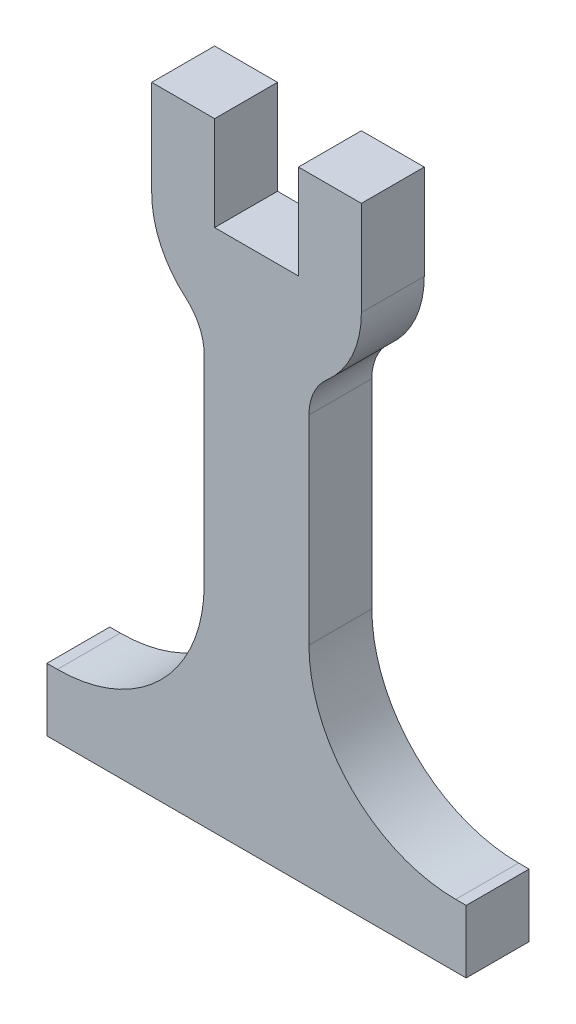
ISO-10303-21;
HEADER;
FILE_DESCRIPTION(('STEP AP214'),'2;1');
FILE_NAME('part.step','',(''),(''),'','','');
FILE_SCHEMA(('AUTOMOTIVE_DESIGN { 1 0 10303 214 1 1 1 1 }'));
ENDSEC;
DATA;
#1=APPLICATION_CONTEXT('core data for automotive mechanical design processes');
#2=APPLICATION_PROTOCOL_DEFINITION('international standard','automotive_design',2000,#1);
#3=PRODUCT_CONTEXT('',#1,'mechanical');
#4=PRODUCT('Part','Part','',(#3));
#5=PRODUCT_RELATED_PRODUCT_CATEGORY('part','',(#4));
#6=PRODUCT_DEFINITION_FORMATION('','',#4);
#7=PRODUCT_DEFINITION_CONTEXT('part definition',#1,'design');
#8=PRODUCT_DEFINITION('design','',#6,#7);
#9=PRODUCT_DEFINITION_SHAPE('','',#8);
#10=(LENGTH_UNIT() NAMED_UNIT(*) SI_UNIT(.MILLI.,.METRE.));
#11=(NAMED_UNIT(*) PLANE_ANGLE_UNIT() SI_UNIT($,.RADIAN.));
#12=(NAMED_UNIT(*) SI_UNIT($,.STERADIAN.) SOLID_ANGLE_UNIT());
#13=UNCERTAINTY_MEASURE_WITH_UNIT(LENGTH_MEASURE(1.E-05),#10,'distance_accuracy_value','');
#14=(GEOMETRIC_REPRESENTATION_CONTEXT(3) GLOBAL_UNCERTAINTY_ASSIGNED_CONTEXT((#13)) GLOBAL_UNIT_ASSIGNED_CONTEXT((#10,
#11,#12)) REPRESENTATION_CONTEXT('',''));
#15=CARTESIAN_POINT('',(0.,0.,0.));
#16=DIRECTION('',(0.,0.,1.));
#17=DIRECTION('',(1.,0.,0.));
#18=AXIS2_PLACEMENT_3D('',#15,#16,#17);
#19=CARTESIAN_POINT('',(3.,3.,3.));
#20=DIRECTION('',(-1.,0.,0.));
#21=DIRECTION('',(0.,0.,1.));
#22=AXIS2_PLACEMENT_3D('',#19,#20,#21);
#23=PLANE('',#22);
#24=DIRECTION('',(0.,1.,0.));
#25=VECTOR('',#24,1.);
#26=CARTESIAN_POINT('',(3.,3.,0.));
#27=LINE('',#26,#25);
#28=CARTESIAN_POINT('',(3.,0.,0.));
#29=VERTEX_POINT('',#28);
#30=CARTESIAN_POINT('',(3.,4.5,0.));
#31=VERTEX_POINT('',#30);
#32=EDGE_CURVE('E126',#29,#31,#27,.T.);
#33=ORIENTED_EDGE('',*,*,#32,.T.);
#34=DIRECTION('',(0.,0.,-1.));
#35=VECTOR('',#34,1.);
#36=CARTESIAN_POINT('',(3.,4.5,3.));
#37=LINE('',#36,#35);
#38=CARTESIAN_POINT('',(3.,4.5,3.));
#39=VERTEX_POINT('',#38);
#40=EDGE_CURVE('E11',#39,#31,#37,.T.);
#41=ORIENTED_EDGE('',*,*,#40,.F.);
#42=DIRECTION('',(0.,1.,0.));
#43=VECTOR('',#42,1.);
#44=CARTESIAN_POINT('',(3.,0.,3.));
#45=LINE('',#44,#43);
#46=CARTESIAN_POINT('',(3.,0.,3.));
#47=VERTEX_POINT('',#46);
#48=EDGE_CURVE('E133',#47,#39,#45,.T.);
#49=ORIENTED_EDGE('',*,*,#48,.F.);
#50=DIRECTION('',(0.,0.,-1.));
#51=VECTOR('',#50,1.);
#52=CARTESIAN_POINT('',(3.,0.,3.));
#53=LINE('',#52,#51);
#54=EDGE_CURVE('E56',#47,#29,#53,.T.);
#55=ORIENTED_EDGE('',*,*,#54,.T.);
#56=EDGE_LOOP('',(#33,#41,#49,#55));
#57=FACE_BOUND('',#56,.T.);
#58=ADVANCED_FACE('F39',(#57),#23,.F.);
#59=CARTESIAN_POINT('',(0.,4.5,3.));
#60=DIRECTION('',(0.,1.,0.));
#61=DIRECTION('',(0.,0.,1.));
#62=AXIS2_PLACEMENT_3D('',#59,#60,#61);
#63=PLANE('',#62);
#64=DIRECTION('',(1.,0.,0.));
#65=VECTOR('',#64,1.);
#66=CARTESIAN_POINT('',(0.,4.5,0.));
#67=LINE('',#66,#65);
#68=CARTESIAN_POINT('',(0.,4.5,0.));
#69=VERTEX_POINT('',#68);
#70=EDGE_CURVE('E215',#69,#31,#67,.T.);
#71=ORIENTED_EDGE('',*,*,#70,.F.);
#72=DIRECTION('',(0.,0.,-1.));
#73=VECTOR('',#72,1.);
#74=CARTESIAN_POINT('',(0.,4.5,3.));
#75=LINE('',#74,#73);
#76=CARTESIAN_POINT('',(0.,4.5,3.));
#77=VERTEX_POINT('',#76);
#78=EDGE_CURVE('E48',#77,#69,#75,.T.);
#79=ORIENTED_EDGE('',*,*,#78,.F.);
#80=DIRECTION('',(1.,0.,0.));
#81=VECTOR('',#80,1.);
#82=CARTESIAN_POINT('',(0.,4.5,3.));
#83=LINE('',#82,#81);
#84=EDGE_CURVE('E362',#77,#39,#83,.T.);
#85=ORIENTED_EDGE('',*,*,#84,.T.);
#86=ORIENTED_EDGE('',*,*,#40,.T.);
#87=EDGE_LOOP('',(#71,#79,#85,#86));
#88=FACE_BOUND('',#87,.T.);
#89=ADVANCED_FACE('F344',(#88),#63,.T.);
#90=CARTESIAN_POINT('',(0.,0.,3.));
#91=DIRECTION('',(1.,0.,0.));
#92=DIRECTION('',(0.,1.,0.));
#93=AXIS2_PLACEMENT_3D('',#90,#91,#92);
#94=PLANE('',#93);
#95=DIRECTION('',(0.,-1.,0.));
#96=VECTOR('',#95,1.);
#97=CARTESIAN_POINT('',(0.,0.,0.));
#98=LINE('',#97,#96);
#99=CARTESIAN_POINT('',(0.,-0.0758606394981101,0.));
#100=VERTEX_POINT('',#99);
#101=EDGE_CURVE('E218',#69,#100,#98,.T.);
#102=ORIENTED_EDGE('',*,*,#101,.T.);
#103=DIRECTION('',(0.,0.,-1.));
#104=VECTOR('',#103,1.);
#105=CARTESIAN_POINT('',(0.,-0.0758606394981101,3.));
#106=LINE('',#105,#104);
#107=CARTESIAN_POINT('',(0.,-0.0758606394981101,3.));
#108=VERTEX_POINT('',#107);
#109=EDGE_CURVE('E331',#108,#100,#106,.T.);
#110=ORIENTED_EDGE('',*,*,#109,.F.);
#111=DIRECTION('',(0.,1.,0.));
#112=VECTOR('',#111,1.);
#113=CARTESIAN_POINT('',(0.,3.,3.));
#114=LINE('',#113,#112);
#115=EDGE_CURVE('E341',#108,#77,#114,.T.);
#116=ORIENTED_EDGE('',*,*,#115,.T.);
#117=ORIENTED_EDGE('',*,*,#78,.T.);
#118=EDGE_LOOP('',(#102,#110,#116,#117));
#119=FACE_BOUND('',#118,.T.);
#120=ADVANCED_FACE('F339',(#119),#94,.F.);
#121=CARTESIAN_POINT('',(4.62293397851248,-0.0758606394981107,3.));
#122=DIRECTION('',(0.,0.,-1.));
#123=DIRECTION('',(-1.,0.,0.));
#124=AXIS2_PLACEMENT_3D('',#121,#122,#123);
#125=CYLINDRICAL_SURFACE('',#124,4.62293397851248);
#126=CARTESIAN_POINT('',(4.62293397851248,-0.0758606394981107,0.));
#127=DIRECTION('',(0.,0.,1.));
#128=DIRECTION('',(1.,0.,0.));
#129=AXIS2_PLACEMENT_3D('',#126,#127,#128);
#130=CIRCLE('',#129,4.62293397851248);
#131=CARTESIAN_POINT('',(1.62476454964812,-3.59473810901994,0.));
#132=VERTEX_POINT('',#131);
#133=EDGE_CURVE('E221',#100,#132,#130,.T.);
#134=ORIENTED_EDGE('',*,*,#133,.T.);
#135=DIRECTION('',(0.,0.,-1.));
#136=VECTOR('',#135,1.);
#137=CARTESIAN_POINT('',(1.62476454964812,-3.59473810901994,3.));
#138=LINE('',#137,#136);
#139=CARTESIAN_POINT('',(1.62476454964812,-3.59473810901994,3.));
#140=VERTEX_POINT('',#139);
#141=EDGE_CURVE('E328',#140,#132,#138,.T.);
#142=ORIENTED_EDGE('',*,*,#141,.F.);
#143=CARTESIAN_POINT('',(4.62293397851248,-0.0758606394981107,3.));
#144=DIRECTION('',(0.,0.,1.));
#145=DIRECTION('',(1.,0.,0.));
#146=AXIS2_PLACEMENT_3D('',#143,#144,#145);
#147=CIRCLE('',#146,4.62293397851248);
#148=EDGE_CURVE('E353',#108,#140,#147,.T.);
#149=ORIENTED_EDGE('',*,*,#148,.F.);
#150=ORIENTED_EDGE('',*,*,#109,.T.);
#151=EDGE_LOOP('',(#134,#142,#149,#150));
#152=FACE_BOUND('',#151,.T.);
#153=ADVANCED_FACE('F350',(#152),#125,.T.);
#154=CARTESIAN_POINT('',(0.00969720289214311,-5.49030279710786,3.));
#155=DIRECTION('',(0.,0.,-1.));
#156=DIRECTION('',(-1.,0.,0.));
#157=AXIS2_PLACEMENT_3D('',#154,#155,#156);
#158=CYLINDRICAL_SURFACE('',#157,2.49030279710786);
#159=CARTESIAN_POINT('',(0.00969720289214311,-5.49030279710786,0.));
#160=DIRECTION('',(0.,0.,1.));
#161=DIRECTION('',(1.,0.,0.));
#162=AXIS2_PLACEMENT_3D('',#159,#160,#161);
#163=CIRCLE('',#162,2.49030279710786);
#164=CARTESIAN_POINT('',(2.5,-5.49030279710788,0.));
#165=VERTEX_POINT('',#164);
#166=EDGE_CURVE('E225',#165,#132,#163,.T.);
#167=ORIENTED_EDGE('',*,*,#166,.F.);
#168=DIRECTION('',(0.,0.,-1.));
#169=VECTOR('',#168,1.);
#170=CARTESIAN_POINT('',(2.5,-5.49030279710788,3.));
#171=LINE('',#170,#169);
#172=CARTESIAN_POINT('',(2.5,-5.49030279710788,3.));
#173=VERTEX_POINT('',#172);
#174=EDGE_CURVE('E324',#173,#165,#171,.T.);
#175=ORIENTED_EDGE('',*,*,#174,.F.);
#176=CARTESIAN_POINT('',(0.00969720289214311,-5.49030279710786,3.));
#177=DIRECTION('',(0.,0.,1.));
#178=DIRECTION('',(1.,0.,0.));
#179=AXIS2_PLACEMENT_3D('',#176,#177,#178);
#180=CIRCLE('',#179,2.49030279710786);
#181=EDGE_CURVE('E356',#173,#140,#180,.T.);
#182=ORIENTED_EDGE('',*,*,#181,.T.);
#183=ORIENTED_EDGE('',*,*,#141,.T.);
#184=EDGE_LOOP('',(#167,#175,#182,#183));
#185=FACE_BOUND('',#184,.T.);
#186=ADVANCED_FACE('F433',(#185),#158,.F.);
#187=CARTESIAN_POINT('',(2.5,-12.5,3.));
#188=DIRECTION('',(1.,0.,0.));
#189=DIRECTION('',(0.,0.,-1.));
#190=AXIS2_PLACEMENT_3D('',#187,#188,#189);
#191=PLANE('',#190);
#192=DIRECTION('',(0.,-1.,0.));
#193=VECTOR('',#192,1.);
#194=CARTESIAN_POINT('',(2.5,-12.5,0.));
#195=LINE('',#194,#193);
#196=CARTESIAN_POINT('',(2.5,-15.,0.));
#197=VERTEX_POINT('',#196);
#198=EDGE_CURVE('E229',#165,#197,#195,.T.);
#199=ORIENTED_EDGE('',*,*,#198,.T.);
#200=DIRECTION('',(0.,0.,-1.));
#201=VECTOR('',#200,1.);
#202=CARTESIAN_POINT('',(2.5,-15.,3.));
#203=LINE('',#202,#201);
#204=CARTESIAN_POINT('',(2.5,-15.,3.));
#205=VERTEX_POINT('',#204);
#206=EDGE_CURVE('E321',#205,#197,#203,.T.);
#207=ORIENTED_EDGE('',*,*,#206,.F.);
#208=DIRECTION('',(0.,1.,0.));
#209=VECTOR('',#208,1.);
#210=CARTESIAN_POINT('',(2.5,-6.25,3.));
#211=LINE('',#210,#209);
#212=EDGE_CURVE('E360',#205,#173,#211,.T.);
#213=ORIENTED_EDGE('',*,*,#212,.T.);
#214=ORIENTED_EDGE('',*,*,#174,.T.);
#215=EDGE_LOOP('',(#199,#207,#213,#214));
#216=FACE_BOUND('',#215,.T.);
#217=ADVANCED_FACE('F436',(#216),#191,.F.);
#218=CARTESIAN_POINT('',(-4.5,-15.,3.));
#219=DIRECTION('',(0.,0.,-1.));
#220=DIRECTION('',(-1.,0.,0.));
#221=AXIS2_PLACEMENT_3D('',#218,#219,#220);
#222=CYLINDRICAL_SURFACE('',#221,7.);
#223=CARTESIAN_POINT('',(-4.5,-15.,0.));
#224=DIRECTION('',(0.,0.,1.));
#225=DIRECTION('',(1.,0.,0.));
#226=AXIS2_PLACEMENT_3D('',#223,#224,#225);
#227=CIRCLE('',#226,7.);
#228=CARTESIAN_POINT('',(-4.50000000000005,-22.,0.));
#229=VERTEX_POINT('',#228);
#230=EDGE_CURVE('E233',#229,#197,#227,.T.);
#231=ORIENTED_EDGE('',*,*,#230,.F.);
#232=DIRECTION('',(0.,0.,-1.));
#233=VECTOR('',#232,1.);
#234=CARTESIAN_POINT('',(-4.50000000000005,-22.,3.));
#235=LINE('',#234,#233);
#236=CARTESIAN_POINT('',(-4.50000000000005,-22.,3.));
#237=VERTEX_POINT('',#236);
#238=EDGE_CURVE('E318',#237,#229,#235,.T.);
#239=ORIENTED_EDGE('',*,*,#238,.F.);
#240=CARTESIAN_POINT('',(-4.5,-15.,3.));
#241=DIRECTION('',(0.,0.,1.));
#242=DIRECTION('',(1.,0.,0.));
#243=AXIS2_PLACEMENT_3D('',#240,#241,#242);
#244=CIRCLE('',#243,7.);
#245=EDGE_CURVE('E369',#237,#205,#244,.T.);
#246=ORIENTED_EDGE('',*,*,#245,.T.);
#247=ORIENTED_EDGE('',*,*,#206,.T.);
#248=EDGE_LOOP('',(#231,#239,#246,#247));
#249=FACE_BOUND('',#248,.T.);
#250=ADVANCED_FACE('F440',(#249),#222,.F.);
#251=CARTESIAN_POINT('',(-5.,-22.,3.));
#252=DIRECTION('',(0.,1.,0.));
#253=DIRECTION('',(0.,0.,1.));
#254=AXIS2_PLACEMENT_3D('',#251,#252,#253);
#255=PLANE('',#254);
#256=DIRECTION('',(1.,0.,0.));
#257=VECTOR('',#256,1.);
#258=CARTESIAN_POINT('',(-5.,-22.,0.));
#259=LINE('',#258,#257);
#260=CARTESIAN_POINT('',(-5.,-22.,0.));
#261=VERTEX_POINT('',#260);
#262=EDGE_CURVE('E237',#261,#229,#259,.T.);
#263=ORIENTED_EDGE('',*,*,#262,.F.);
#264=DIRECTION('',(0.,0.,-1.));
#265=VECTOR('',#264,1.);
#266=CARTESIAN_POINT('',(-5.,-22.,3.));
#267=LINE('',#266,#265);
#268=CARTESIAN_POINT('',(-5.,-22.,3.));
#269=VERTEX_POINT('',#268);
#270=EDGE_CURVE('E315',#269,#261,#267,.T.);
#271=ORIENTED_EDGE('',*,*,#270,.F.);
#272=DIRECTION('',(1.,0.,0.));
#273=VECTOR('',#272,1.);
#274=CARTESIAN_POINT('',(-5.,-22.,3.));
#275=LINE('',#274,#273);
#276=EDGE_CURVE('E373',#269,#237,#275,.T.);
#277=ORIENTED_EDGE('',*,*,#276,.T.);
#278=ORIENTED_EDGE('',*,*,#238,.T.);
#279=EDGE_LOOP('',(#263,#271,#277,#278));
#280=FACE_BOUND('',#279,.T.);
#281=ADVANCED_FACE('F444',(#280),#255,.T.);
#282=CARTESIAN_POINT('',(-5.,-25.,3.));
#283=DIRECTION('',(-1.,0.,0.));
#284=DIRECTION('',(0.,0.,1.));
#285=AXIS2_PLACEMENT_3D('',#282,#283,#284);
#286=PLANE('',#285);
#287=DIRECTION('',(0.,1.,0.));
#288=VECTOR('',#287,1.);
#289=CARTESIAN_POINT('',(-5.,-25.,0.));
#290=LINE('',#289,#288);
#291=CARTESIAN_POINT('',(-5.,-25.,0.));
#292=VERTEX_POINT('',#291);
#293=EDGE_CURVE('E241',#292,#261,#290,.T.);
#294=ORIENTED_EDGE('',*,*,#293,.F.);
#295=DIRECTION('',(0.,0.,-1.));
#296=VECTOR('',#295,1.);
#297=CARTESIAN_POINT('',(-5.,-25.,3.));
#298=LINE('',#297,#296);
#299=CARTESIAN_POINT('',(-5.,-25.,3.));
#300=VERTEX_POINT('',#299);
#301=EDGE_CURVE('E312',#300,#292,#298,.T.);
#302=ORIENTED_EDGE('',*,*,#301,.F.);
#303=DIRECTION('',(0.,1.,0.));
#304=VECTOR('',#303,1.);
#305=CARTESIAN_POINT('',(-5.,-25.,3.));
#306=LINE('',#305,#304);
#307=EDGE_CURVE('E377',#300,#269,#306,.T.);
#308=ORIENTED_EDGE('',*,*,#307,.T.);
#309=ORIENTED_EDGE('',*,*,#270,.T.);
#310=EDGE_LOOP('',(#294,#302,#308,#309));
#311=FACE_BOUND('',#310,.T.);
#312=ADVANCED_FACE('F448',(#311),#286,.T.);
#313=CARTESIAN_POINT('',(-5.,-25.,3.));
#314=DIRECTION('',(0.,1.,0.));
#315=DIRECTION('',(0.,0.,1.));
#316=AXIS2_PLACEMENT_3D('',#313,#314,#315);
#317=PLANE('',#316);
#318=DIRECTION('',(1.,0.,0.));
#319=VECTOR('',#318,1.);
#320=CARTESIAN_POINT('',(-5.,-25.,0.));
#321=LINE('',#320,#319);
#322=CARTESIAN_POINT('',(15.,-25.,0.));
#323=VERTEX_POINT('',#322);
#324=EDGE_CURVE('E245',#292,#323,#321,.T.);
#325=ORIENTED_EDGE('',*,*,#324,.T.);
#326=DIRECTION('',(0.,0.,-1.));
#327=VECTOR('',#326,1.);
#328=CARTESIAN_POINT('',(15.,-25.,3.));
#329=LINE('',#328,#327);
#330=CARTESIAN_POINT('',(15.,-25.,3.));
#331=VERTEX_POINT('',#330);
#332=EDGE_CURVE('E308',#331,#323,#329,.T.);
#333=ORIENTED_EDGE('',*,*,#332,.F.);
#334=DIRECTION('',(1.,0.,0.));
#335=VECTOR('',#334,1.);
#336=CARTESIAN_POINT('',(-5.,-25.,3.));
#337=LINE('',#336,#335);
#338=EDGE_CURVE('E381',#300,#331,#337,.T.);
#339=ORIENTED_EDGE('',*,*,#338,.F.);
#340=ORIENTED_EDGE('',*,*,#301,.T.);
#341=EDGE_LOOP('',(#325,#333,#339,#340));
#342=FACE_BOUND('',#341,.T.);
#343=ADVANCED_FACE('F452',(#342),#317,.F.);
#344=CARTESIAN_POINT('',(15.,-25.,3.));
#345=DIRECTION('',(-1.,0.,0.));
#346=DIRECTION('',(0.,0.,1.));
#347=AXIS2_PLACEMENT_3D('',#344,#345,#346);
#348=PLANE('',#347);
#349=DIRECTION('',(0.,1.,0.));
#350=VECTOR('',#349,1.);
#351=CARTESIAN_POINT('',(15.,-25.,0.));
#352=LINE('',#351,#350);
#353=CARTESIAN_POINT('',(15.,-22.,0.));
#354=VERTEX_POINT('',#353);
#355=EDGE_CURVE('E248',#323,#354,#352,.T.);
#356=ORIENTED_EDGE('',*,*,#355,.T.);
#357=DIRECTION('',(0.,0.,-1.));
#358=VECTOR('',#357,1.);
#359=CARTESIAN_POINT('',(15.,-22.,3.));
#360=LINE('',#359,#358);
#361=CARTESIAN_POINT('',(15.,-22.,3.));
#362=VERTEX_POINT('',#361);
#363=EDGE_CURVE('E305',#362,#354,#360,.T.);
#364=ORIENTED_EDGE('',*,*,#363,.F.);
#365=DIRECTION('',(0.,1.,0.));
#366=VECTOR('',#365,1.);
#367=CARTESIAN_POINT('',(15.,-25.,3.));
#368=LINE('',#367,#366);
#369=EDGE_CURVE('E384',#331,#362,#368,.T.);
#370=ORIENTED_EDGE('',*,*,#369,.F.);
#371=ORIENTED_EDGE('',*,*,#332,.T.);
#372=EDGE_LOOP('',(#356,#364,#370,#371));
#373=FACE_BOUND('',#372,.T.);
#374=ADVANCED_FACE('F456',(#373),#348,.F.);
#375=CARTESIAN_POINT('',(14.5000000000001,-22.,3.));
#376=DIRECTION('',(0.,1.,0.));
#377=DIRECTION('',(0.,0.,1.));
#378=AXIS2_PLACEMENT_3D('',#375,#376,#377);
#379=PLANE('',#378);
#380=DIRECTION('',(1.,0.,0.));
#381=VECTOR('',#380,1.);
#382=CARTESIAN_POINT('',(14.5000000000001,-22.,0.));
#383=LINE('',#382,#381);
#384=CARTESIAN_POINT('',(14.5000000000001,-22.,0.));
#385=VERTEX_POINT('',#384);
#386=EDGE_CURVE('E252',#385,#354,#383,.T.);
#387=ORIENTED_EDGE('',*,*,#386,.F.);
#388=DIRECTION('',(0.,0.,-1.));
#389=VECTOR('',#388,1.);
#390=CARTESIAN_POINT('',(14.5000000000001,-22.,3.));
#391=LINE('',#390,#389);
#392=CARTESIAN_POINT('',(14.5000000000001,-22.,3.));
#393=VERTEX_POINT('',#392);
#394=EDGE_CURVE('E302',#393,#385,#391,.T.);
#395=ORIENTED_EDGE('',*,*,#394,.F.);
#396=DIRECTION('',(1.,0.,0.));
#397=VECTOR('',#396,1.);
#398=CARTESIAN_POINT('',(14.5000000000001,-22.,3.));
#399=LINE('',#398,#397);
#400=EDGE_CURVE('E387',#393,#362,#399,.T.);
#401=ORIENTED_EDGE('',*,*,#400,.T.);
#402=ORIENTED_EDGE('',*,*,#363,.T.);
#403=EDGE_LOOP('',(#387,#395,#401,#402));
#404=FACE_BOUND('',#403,.T.);
#405=ADVANCED_FACE('F460',(#404),#379,.T.);
#406=CARTESIAN_POINT('',(14.5,-15.,3.));
#407=DIRECTION('',(0.,0.,-1.));
#408=DIRECTION('',(-1.,0.,0.));
#409=AXIS2_PLACEMENT_3D('',#406,#407,#408);
#410=CYLINDRICAL_SURFACE('',#409,7.);
#411=CARTESIAN_POINT('',(14.5,-15.,0.));
#412=DIRECTION('',(0.,0.,-1.));
#413=DIRECTION('',(-1.,0.,0.));
#414=AXIS2_PLACEMENT_3D('',#411,#412,#413);
#415=CIRCLE('',#414,7.);
#416=CARTESIAN_POINT('',(7.5,-15.,0.));
#417=VERTEX_POINT('',#416);
#418=EDGE_CURVE('E256',#385,#417,#415,.T.);
#419=ORIENTED_EDGE('',*,*,#418,.T.);
#420=DIRECTION('',(0.,0.,-1.));
#421=VECTOR('',#420,1.);
#422=CARTESIAN_POINT('',(7.5,-15.,3.));
#423=LINE('',#422,#421);
#424=CARTESIAN_POINT('',(7.5,-15.,3.));
#425=VERTEX_POINT('',#424);
#426=EDGE_CURVE('E298',#425,#417,#423,.T.);
#427=ORIENTED_EDGE('',*,*,#426,.F.);
#428=CARTESIAN_POINT('',(14.5,-15.,3.));
#429=DIRECTION('',(0.,0.,-1.));
#430=DIRECTION('',(-1.,0.,0.));
#431=AXIS2_PLACEMENT_3D('',#428,#429,#430);
#432=CIRCLE('',#431,7.);
#433=EDGE_CURVE('E391',#393,#425,#432,.T.);
#434=ORIENTED_EDGE('',*,*,#433,.F.);
#435=ORIENTED_EDGE('',*,*,#394,.T.);
#436=EDGE_LOOP('',(#419,#427,#434,#435));
#437=FACE_BOUND('',#436,.T.);
#438=ADVANCED_FACE('F464',(#437),#410,.F.);
#439=CARTESIAN_POINT('',(7.5,-5.49030279710788,3.));
#440=DIRECTION('',(1.,0.,0.));
#441=DIRECTION('',(0.,0.,-1.));
#442=AXIS2_PLACEMENT_3D('',#439,#440,#441);
#443=PLANE('',#442);
#444=DIRECTION('',(0.,-1.,0.));
#445=VECTOR('',#444,1.);
#446=CARTESIAN_POINT('',(7.5,-5.49030279710788,0.));
#447=LINE('',#446,#445);
#448=CARTESIAN_POINT('',(7.5,-5.49030279710788,0.));
#449=VERTEX_POINT('',#448);
#450=EDGE_CURVE('E260',#449,#417,#447,.T.);
#451=ORIENTED_EDGE('',*,*,#450,.F.);
#452=DIRECTION('',(0.,0.,-1.));
#453=VECTOR('',#452,1.);
#454=CARTESIAN_POINT('',(7.5,-5.49030279710788,3.));
#455=LINE('',#454,#453);
#456=CARTESIAN_POINT('',(7.5,-5.49030279710788,3.));
#457=VERTEX_POINT('',#456);
#458=EDGE_CURVE('E295',#457,#449,#455,.T.);
#459=ORIENTED_EDGE('',*,*,#458,.F.);
#460=DIRECTION('',(0.,1.,0.));
#461=VECTOR('',#460,1.);
#462=CARTESIAN_POINT('',(7.5,-15.,3.));
#463=LINE('',#462,#461);
#464=EDGE_CURVE('E394',#425,#457,#463,.T.);
#465=ORIENTED_EDGE('',*,*,#464,.F.);
#466=ORIENTED_EDGE('',*,*,#426,.T.);
#467=EDGE_LOOP('',(#451,#459,#465,#466));
#468=FACE_BOUND('',#467,.T.);
#469=ADVANCED_FACE('F468',(#468),#443,.T.);
#470=CARTESIAN_POINT('',(9.99030279710786,-5.49030279710786,3.));
#471=DIRECTION('',(0.,0.,-1.));
#472=DIRECTION('',(-1.,0.,0.));
#473=AXIS2_PLACEMENT_3D('',#470,#471,#472);
#474=CYLINDRICAL_SURFACE('',#473,2.49030279710786);
#475=CARTESIAN_POINT('',(9.99030279710786,-5.49030279710786,0.));
#476=DIRECTION('',(0.,0.,-1.));
#477=DIRECTION('',(-1.,0.,0.));
#478=AXIS2_PLACEMENT_3D('',#475,#476,#477);
#479=CIRCLE('',#478,2.49030279710786);
#480=CARTESIAN_POINT('',(8.35931947860829,-3.6084150650528,0.));
#481=VERTEX_POINT('',#480);
#482=EDGE_CURVE('E263',#449,#481,#479,.T.);
#483=ORIENTED_EDGE('',*,*,#482,.T.);
#484=DIRECTION('',(0.,0.,-1.));
#485=VECTOR('',#484,1.);
#486=CARTESIAN_POINT('',(8.35931947860829,-3.6084150650528,3.));
#487=LINE('',#486,#485);
#488=CARTESIAN_POINT('',(8.35931947860829,-3.6084150650528,3.));
#489=VERTEX_POINT('',#488);
#490=EDGE_CURVE('E291',#489,#481,#487,.T.);
#491=ORIENTED_EDGE('',*,*,#490,.F.);
#492=CARTESIAN_POINT('',(9.99030279710786,-5.49030279710786,3.));
#493=DIRECTION('',(0.,0.,-1.));
#494=DIRECTION('',(-1.,0.,0.));
#495=AXIS2_PLACEMENT_3D('',#492,#493,#494);
#496=CIRCLE('',#495,2.49030279710786);
#497=EDGE_CURVE('E397',#457,#489,#496,.T.);
#498=ORIENTED_EDGE('',*,*,#497,.F.);
#499=ORIENTED_EDGE('',*,*,#458,.T.);
#500=EDGE_LOOP('',(#483,#491,#498,#499));
#501=FACE_BOUND('',#500,.T.);
#502=ADVANCED_FACE('F472',(#501),#474,.F.);
#503=CARTESIAN_POINT('',(5.24531749449072,-0.0153665862387574,3.));
#504=DIRECTION('',(0.,0.,-1.));
#505=DIRECTION('',(-1.,0.,0.));
#506=AXIS2_PLACEMENT_3D('',#503,#504,#505);
#507=CYLINDRICAL_SURFACE('',#506,4.75468250550928);
#508=CARTESIAN_POINT('',(5.24531749449072,-0.0153665862387574,0.));
#509=DIRECTION('',(0.,0.,1.));
#510=DIRECTION('',(1.,0.,0.));
#511=AXIS2_PLACEMENT_3D('',#508,#509,#510);
#512=CIRCLE('',#511,4.75468250550928);
#513=CARTESIAN_POINT('',(10.,-0.0153665862387574,0.));
#514=VERTEX_POINT('',#513);
#515=EDGE_CURVE('E266',#481,#514,#512,.T.);
#516=ORIENTED_EDGE('',*,*,#515,.T.);
#517=DIRECTION('',(0.,0.,-1.));
#518=VECTOR('',#517,1.);
#519=CARTESIAN_POINT('',(10.,-0.0153665862387574,3.));
#520=LINE('',#519,#518);
#521=CARTESIAN_POINT('',(10.,-0.0153665862387574,3.));
#522=VERTEX_POINT('',#521);
#523=EDGE_CURVE('E287',#522,#514,#520,.T.);
#524=ORIENTED_EDGE('',*,*,#523,.F.);
#525=CARTESIAN_POINT('',(5.24531749449072,-0.0153665862387574,3.));
#526=DIRECTION('',(0.,0.,1.));
#527=DIRECTION('',(1.,0.,0.));
#528=AXIS2_PLACEMENT_3D('',#525,#526,#527);
#529=CIRCLE('',#528,4.75468250550928);
#530=EDGE_CURVE('E400',#489,#522,#529,.T.);
#531=ORIENTED_EDGE('',*,*,#530,.F.);
#532=ORIENTED_EDGE('',*,*,#490,.T.);
#533=EDGE_LOOP('',(#516,#524,#531,#532));
#534=FACE_BOUND('',#533,.T.);
#535=ADVANCED_FACE('F476',(#534),#507,.T.);
#536=CARTESIAN_POINT('',(10.,4.5,3.));
#537=DIRECTION('',(1.,0.,0.));
#538=DIRECTION('',(0.,0.,-1.));
#539=AXIS2_PLACEMENT_3D('',#536,#537,#538);
#540=PLANE('',#539);
#541=DIRECTION('',(0.,-1.,0.));
#542=VECTOR('',#541,1.);
#543=CARTESIAN_POINT('',(10.,4.5,0.));
#544=LINE('',#543,#542);
#545=CARTESIAN_POINT('',(10.,4.5,0.));
#546=VERTEX_POINT('',#545);
#547=EDGE_CURVE('E270',#546,#514,#544,.T.);
#548=ORIENTED_EDGE('',*,*,#547,.F.);
#549=DIRECTION('',(0.,0.,-1.));
#550=VECTOR('',#549,1.);
#551=CARTESIAN_POINT('',(10.,4.5,3.));
#552=LINE('',#551,#550);
#553=CARTESIAN_POINT('',(10.,4.5,3.));
#554=VERTEX_POINT('',#553);
#555=EDGE_CURVE('E196',#554,#546,#552,.T.);
#556=ORIENTED_EDGE('',*,*,#555,.F.);
#557=DIRECTION('',(0.,-1.,0.));
#558=VECTOR('',#557,1.);
#559=CARTESIAN_POINT('',(10.,0.,3.));
#560=LINE('',#559,#558);
#561=EDGE_CURVE('E201',#554,#522,#560,.T.);
#562=ORIENTED_EDGE('',*,*,#561,.T.);
#563=ORIENTED_EDGE('',*,*,#523,.T.);
#564=EDGE_LOOP('',(#548,#556,#562,#563));
#565=FACE_BOUND('',#564,.T.);
#566=ADVANCED_FACE('F405',(#565),#540,.T.);
#567=CARTESIAN_POINT('',(7.,4.5,3.));
#568=DIRECTION('',(0.,1.,0.));
#569=DIRECTION('',(0.,0.,1.));
#570=AXIS2_PLACEMENT_3D('',#567,#568,#569);
#571=PLANE('',#570);
#572=DIRECTION('',(1.,0.,0.));
#573=VECTOR('',#572,1.);
#574=CARTESIAN_POINT('',(7.,4.5,0.));
#575=LINE('',#574,#573);
#576=CARTESIAN_POINT('',(7.,4.5,0.));
#577=VERTEX_POINT('',#576);
#578=EDGE_CURVE('E192',#577,#546,#575,.T.);
#579=ORIENTED_EDGE('',*,*,#578,.F.);
#580=DIRECTION('',(0.,0.,-1.));
#581=VECTOR('',#580,1.);
#582=CARTESIAN_POINT('',(7.,4.5,3.));
#583=LINE('',#582,#581);
#584=CARTESIAN_POINT('',(7.,4.5,3.));
#585=VERTEX_POINT('',#584);
#586=EDGE_CURVE('E187',#585,#577,#583,.T.);
#587=ORIENTED_EDGE('',*,*,#586,.F.);
#588=DIRECTION('',(1.,0.,0.));
#589=VECTOR('',#588,1.);
#590=CARTESIAN_POINT('',(7.,4.5,3.));
#591=LINE('',#590,#589);
#592=EDGE_CURVE('E190',#585,#554,#591,.T.);
#593=ORIENTED_EDGE('',*,*,#592,.T.);
#594=ORIENTED_EDGE('',*,*,#555,.T.);
#595=EDGE_LOOP('',(#579,#587,#593,#594));
#596=FACE_BOUND('',#595,.T.);
#597=ADVANCED_FACE('F189',(#596),#571,.T.);
#598=CARTESIAN_POINT('',(7.,0.,3.));
#599=DIRECTION('',(-1.,0.,0.));
#600=DIRECTION('',(0.,0.,1.));
#601=AXIS2_PLACEMENT_3D('',#598,#599,#600);
#602=PLANE('',#601);
#603=DIRECTION('',(0.,1.,0.));
#604=VECTOR('',#603,1.);
#605=CARTESIAN_POINT('',(7.,0.,0.));
#606=LINE('',#605,#604);
#607=CARTESIAN_POINT('',(7.,0.,0.));
#608=VERTEX_POINT('',#607);
#609=EDGE_CURVE('E275',#608,#577,#606,.T.);
#610=ORIENTED_EDGE('',*,*,#609,.F.);
#611=DIRECTION('',(0.,0.,-1.));
#612=VECTOR('',#611,1.);
#613=CARTESIAN_POINT('',(7.,0.,3.));
#614=LINE('',#613,#612);
#615=CARTESIAN_POINT('',(7.,0.,3.));
#616=VERTEX_POINT('',#615);
#617=EDGE_CURVE('E118',#616,#608,#614,.T.);
#618=ORIENTED_EDGE('',*,*,#617,.F.);
#619=DIRECTION('',(0.,1.,0.));
#620=VECTOR('',#619,1.);
#621=CARTESIAN_POINT('',(7.,3.,3.));
#622=LINE('',#621,#620);
#623=EDGE_CURVE('E199',#616,#585,#622,.T.);
#624=ORIENTED_EDGE('',*,*,#623,.T.);
#625=ORIENTED_EDGE('',*,*,#586,.T.);
#626=EDGE_LOOP('',(#610,#618,#624,#625));
#627=FACE_BOUND('',#626,.T.);
#628=ADVANCED_FACE('F205',(#627),#602,.T.);
#629=CARTESIAN_POINT('',(3.,0.,3.));
#630=DIRECTION('',(0.,1.,0.));
#631=DIRECTION('',(0.,0.,1.));
#632=AXIS2_PLACEMENT_3D('',#629,#630,#631);
#633=PLANE('',#632);
#634=DIRECTION('',(1.,0.,0.));
#635=VECTOR('',#634,1.);
#636=CARTESIAN_POINT('',(3.,0.,0.));
#637=LINE('',#636,#635);
#638=EDGE_CURVE('E278',#29,#608,#637,.T.);
#639=ORIENTED_EDGE('',*,*,#638,.F.);
#640=ORIENTED_EDGE('',*,*,#54,.F.);
#641=DIRECTION('',(1.,0.,0.));
#642=VECTOR('',#641,1.);
#643=CARTESIAN_POINT('',(3.,0.,3.));
#644=LINE('',#643,#642);
#645=EDGE_CURVE('E207',#47,#616,#644,.T.);
#646=ORIENTED_EDGE('',*,*,#645,.T.);
#647=ORIENTED_EDGE('',*,*,#617,.T.);
#648=EDGE_LOOP('',(#639,#640,#646,#647));
#649=FACE_BOUND('',#648,.T.);
#650=ADVANCED_FACE('F408',(#649),#633,.T.);
#651=CARTESIAN_POINT('',(4.62293397851248,-0.0758606394981107,3.));
#652=DIRECTION('',(0.,0.,1.));
#653=DIRECTION('',(1.,0.,0.));
#654=AXIS2_PLACEMENT_3D('',#651,#652,#653);
#655=PLANE('',#654);
#656=ORIENTED_EDGE('',*,*,#48,.T.);
#657=ORIENTED_EDGE('',*,*,#84,.F.);
#658=ORIENTED_EDGE('',*,*,#115,.F.);
#659=ORIENTED_EDGE('',*,*,#148,.T.);
#660=ORIENTED_EDGE('',*,*,#181,.F.);
#661=ORIENTED_EDGE('',*,*,#212,.F.);
#662=ORIENTED_EDGE('',*,*,#245,.F.);
#663=ORIENTED_EDGE('',*,*,#276,.F.);
#664=ORIENTED_EDGE('',*,*,#307,.F.);
#665=ORIENTED_EDGE('',*,*,#338,.T.);
#666=ORIENTED_EDGE('',*,*,#369,.T.);
#667=ORIENTED_EDGE('',*,*,#400,.F.);
#668=ORIENTED_EDGE('',*,*,#433,.T.);
#669=ORIENTED_EDGE('',*,*,#464,.T.);
#670=ORIENTED_EDGE('',*,*,#497,.T.);
#671=ORIENTED_EDGE('',*,*,#530,.T.);
#672=ORIENTED_EDGE('',*,*,#561,.F.);
#673=ORIENTED_EDGE('',*,*,#592,.F.);
#674=ORIENTED_EDGE('',*,*,#623,.F.);
#675=ORIENTED_EDGE('',*,*,#645,.F.);
#676=EDGE_LOOP('',(#656,#657,#658,#659,#660,#661,#662,#663,#664,#665,#666,#667,#668,#669,#670,
#671,#672,#673,#674,#675));
#677=FACE_BOUND('',#676,.T.);
#678=ADVANCED_FACE('F198',(#677),#655,.T.);
#679=CARTESIAN_POINT('',(4.62293397851248,-0.0758606394981107,0.));
#680=DIRECTION('',(0.,0.,1.));
#681=DIRECTION('',(1.,0.,0.));
#682=AXIS2_PLACEMENT_3D('',#679,#680,#681);
#683=PLANE('',#682);
#684=ORIENTED_EDGE('',*,*,#32,.F.);
#685=ORIENTED_EDGE('',*,*,#638,.T.);
#686=ORIENTED_EDGE('',*,*,#609,.T.);
#687=ORIENTED_EDGE('',*,*,#578,.T.);
#688=ORIENTED_EDGE('',*,*,#547,.T.);
#689=ORIENTED_EDGE('',*,*,#515,.F.);
#690=ORIENTED_EDGE('',*,*,#482,.F.);
#691=ORIENTED_EDGE('',*,*,#450,.T.);
#692=ORIENTED_EDGE('',*,*,#418,.F.);
#693=ORIENTED_EDGE('',*,*,#386,.T.);
#694=ORIENTED_EDGE('',*,*,#355,.F.);
#695=ORIENTED_EDGE('',*,*,#324,.F.);
#696=ORIENTED_EDGE('',*,*,#293,.T.);
#697=ORIENTED_EDGE('',*,*,#262,.T.);
#698=ORIENTED_EDGE('',*,*,#230,.T.);
#699=ORIENTED_EDGE('',*,*,#198,.F.);
#700=ORIENTED_EDGE('',*,*,#166,.T.);
#701=ORIENTED_EDGE('',*,*,#133,.F.);
#702=ORIENTED_EDGE('',*,*,#101,.F.);
#703=ORIENTED_EDGE('',*,*,#70,.T.);
#704=EDGE_LOOP('',(#684,#685,#686,#687,#688,#689,#690,#691,#692,#693,#694,#695,#696,#697,#698,
#699,#700,#701,#702,#703));
#705=FACE_BOUND('',#704,.T.);
#706=ADVANCED_FACE('F345',(#705),#683,.F.);
#707=CLOSED_SHELL('',(#58,#89,#120,#153,#186,#217,#250,#281,#312,#343,#374,#405,#438,#469,#502,
#535,#566,#597,#628,#650,#678,#706));
#708=MANIFOLD_SOLID_BREP('B2',#707);
#709=ADVANCED_BREP_SHAPE_REPRESENTATION('',(#18,#708),#14);
#710=SHAPE_DEFINITION_REPRESENTATION(#9,#709);
ENDSEC;
END-ISO-10303-21;
